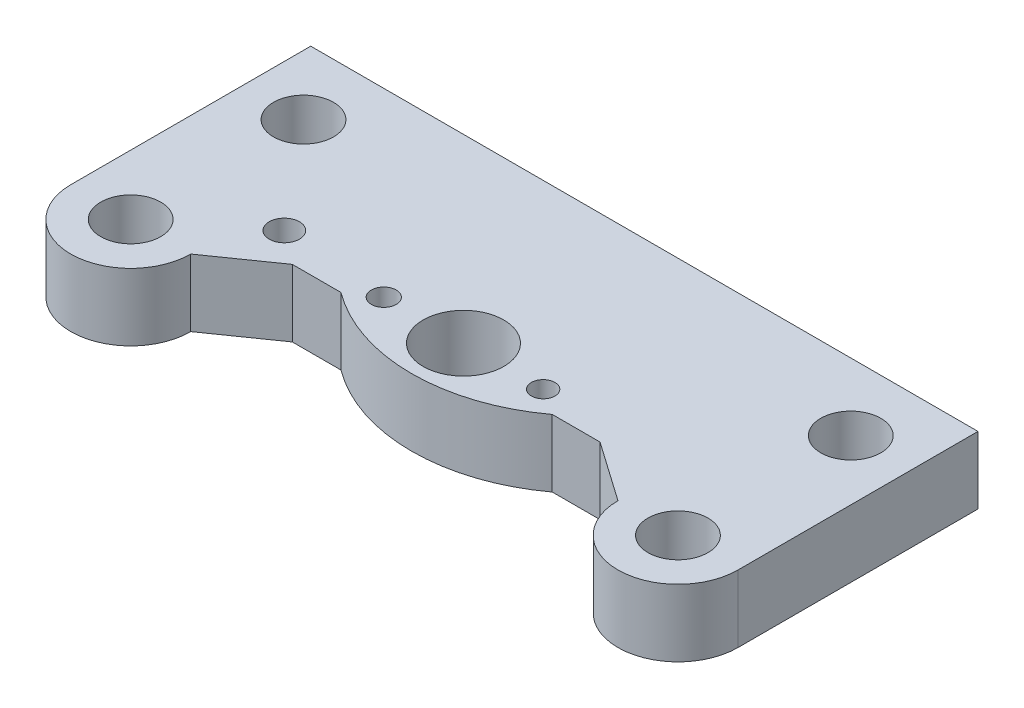
ISO-10303-21;
HEADER;
FILE_DESCRIPTION(('STEP AP214'),'2;1');
FILE_NAME('part.step','',(''),(''),'','','');
FILE_SCHEMA(('AUTOMOTIVE_DESIGN { 1 0 10303 214 1 1 1 1 }'));
ENDSEC;
DATA;
#1=APPLICATION_CONTEXT('core data for automotive mechanical design processes');
#2=APPLICATION_PROTOCOL_DEFINITION('international standard','automotive_design',2000,#1);
#3=PRODUCT_CONTEXT('',#1,'mechanical');
#4=PRODUCT('Part','Part','',(#3));
#5=PRODUCT_RELATED_PRODUCT_CATEGORY('part','',(#4));
#6=PRODUCT_DEFINITION_FORMATION('','',#4);
#7=PRODUCT_DEFINITION_CONTEXT('part definition',#1,'design');
#8=PRODUCT_DEFINITION('design','',#6,#7);
#9=PRODUCT_DEFINITION_SHAPE('','',#8);
#10=(LENGTH_UNIT() NAMED_UNIT(*) SI_UNIT(.MILLI.,.METRE.));
#11=(NAMED_UNIT(*) PLANE_ANGLE_UNIT() SI_UNIT($,.RADIAN.));
#12=(NAMED_UNIT(*) SI_UNIT($,.STERADIAN.) SOLID_ANGLE_UNIT());
#13=UNCERTAINTY_MEASURE_WITH_UNIT(LENGTH_MEASURE(1.E-05),#10,'distance_accuracy_value','');
#14=(GEOMETRIC_REPRESENTATION_CONTEXT(3) GLOBAL_UNCERTAINTY_ASSIGNED_CONTEXT((#13)) GLOBAL_UNIT_ASSIGNED_CONTEXT((#10,
#11,#12)) REPRESENTATION_CONTEXT('',''));
#15=CARTESIAN_POINT('',(0.,0.,0.));
#16=DIRECTION('',(0.,0.,1.));
#17=DIRECTION('',(1.,0.,0.));
#18=AXIS2_PLACEMENT_3D('',#15,#16,#17);
#19=CARTESIAN_POINT('',(72.39,-8.89,0.));
#20=DIRECTION('',(0.,1.,0.));
#21=DIRECTION('',(0.,0.,1.));
#22=AXIS2_PLACEMENT_3D('',#19,#20,#21);
#23=CYLINDRICAL_SURFACE('',#22,7.93749999999999);
#24=CARTESIAN_POINT('',(72.39,0.,0.));
#25=DIRECTION('',(0.,1.,0.));
#26=DIRECTION('',(0.,0.,-1.));
#27=AXIS2_PLACEMENT_3D('',#24,#25,#26);
#28=CIRCLE('',#27,7.93749999999999);
#29=CARTESIAN_POINT('',(64.4525,0.,0.));
#30=VERTEX_POINT('',#29);
#31=CARTESIAN_POINT('',(80.3275,0.,0.));
#32=VERTEX_POINT('',#31);
#33=EDGE_CURVE('E157',#30,#32,#28,.T.);
#34=ORIENTED_EDGE('',*,*,#33,.F.);
#35=DIRECTION('',(0.,1.,0.));
#36=VECTOR('',#35,1.);
#37=CARTESIAN_POINT('',(64.4525,-8.89,0.));
#38=LINE('',#37,#36);
#39=CARTESIAN_POINT('',(64.4525,-8.89,0.));
#40=VERTEX_POINT('',#39);
#41=EDGE_CURVE('E11',#40,#30,#38,.T.);
#42=ORIENTED_EDGE('',*,*,#41,.F.);
#43=CARTESIAN_POINT('',(72.39,-8.89,0.));
#44=DIRECTION('',(0.,1.,0.));
#45=DIRECTION('',(0.,0.,-1.));
#46=AXIS2_PLACEMENT_3D('',#43,#44,#45);
#47=CIRCLE('',#46,7.93749999999999);
#48=CARTESIAN_POINT('',(80.3275,-8.89,0.));
#49=VERTEX_POINT('',#48);
#50=EDGE_CURVE('E194',#40,#49,#47,.T.);
#51=ORIENTED_EDGE('',*,*,#50,.T.);
#52=DIRECTION('',(0.,1.,0.));
#53=VECTOR('',#52,1.);
#54=CARTESIAN_POINT('',(80.3275,-8.89,0.));
#55=LINE('',#54,#53);
#56=EDGE_CURVE('E46',#49,#32,#55,.T.);
#57=ORIENTED_EDGE('',*,*,#56,.T.);
#58=EDGE_LOOP('',(#34,#42,#51,#57));
#59=FACE_BOUND('',#58,.T.);
#60=ADVANCED_FACE('F43',(#59),#23,.T.);
#61=CARTESIAN_POINT('',(64.4525,-8.89,0.));
#62=DIRECTION('',(-0.573576436351041,0.,0.819152044288995));
#63=DIRECTION('',(0.819152044288995,0.,0.573576436351041));
#64=AXIS2_PLACEMENT_3D('',#61,#62,#63);
#65=PLANE('',#64);
#66=DIRECTION('',(0.819152044288995,0.,0.573576436351041));
#67=VECTOR('',#66,1.);
#68=CARTESIAN_POINT('',(64.4525,0.,0.));
#69=LINE('',#68,#67);
#70=CARTESIAN_POINT('',(56.5460444685226,0.,-5.53615976366025));
#71=VERTEX_POINT('',#70);
#72=EDGE_CURVE('E191',#71,#30,#69,.T.);
#73=ORIENTED_EDGE('',*,*,#72,.F.);
#74=DIRECTION('',(0.,1.,0.));
#75=VECTOR('',#74,1.);
#76=CARTESIAN_POINT('',(56.5460444685226,-8.89,-5.53615976366025));
#77=LINE('',#76,#75);
#78=CARTESIAN_POINT('',(56.5460444685226,-8.89,-5.53615976366025));
#79=VERTEX_POINT('',#78);
#80=EDGE_CURVE('E53',#79,#71,#77,.T.);
#81=ORIENTED_EDGE('',*,*,#80,.F.);
#82=DIRECTION('',(0.819152044288995,0.,0.573576436351041));
#83=VECTOR('',#82,1.);
#84=CARTESIAN_POINT('',(64.4525,-8.89,0.));
#85=LINE('',#84,#83);
#86=EDGE_CURVE('E143',#79,#40,#85,.T.);
#87=ORIENTED_EDGE('',*,*,#86,.T.);
#88=ORIENTED_EDGE('',*,*,#41,.T.);
#89=EDGE_LOOP('',(#73,#81,#87,#88));
#90=FACE_BOUND('',#89,.T.);
#91=ADVANCED_FACE('F219',(#90),#65,.T.);
#92=CARTESIAN_POINT('',(56.5460444685226,-8.89,-5.53615976366025));
#93=DIRECTION('',(0.,0.,1.));
#94=DIRECTION('',(1.,0.,0.));
#95=AXIS2_PLACEMENT_3D('',#92,#93,#94);
#96=PLANE('',#95);
#97=DIRECTION('',(1.,0.,0.));
#98=VECTOR('',#97,1.);
#99=CARTESIAN_POINT('',(56.5460444685226,0.,-5.53615976366025));
#100=LINE('',#99,#98);
#101=CARTESIAN_POINT('',(50.2217496785397,0.,-5.53615976366026));
#102=VERTEX_POINT('',#101);
#103=EDGE_CURVE('E129',#102,#71,#100,.T.);
#104=ORIENTED_EDGE('',*,*,#103,.F.);
#105=DIRECTION('',(0.,1.,0.));
#106=VECTOR('',#105,1.);
#107=CARTESIAN_POINT('',(50.2217496785397,-8.89,-5.53615976366026));
#108=LINE('',#107,#106);
#109=CARTESIAN_POINT('',(50.2217496785397,-8.89,-5.53615976366026));
#110=VERTEX_POINT('',#109);
#111=EDGE_CURVE('E124',#110,#102,#108,.T.);
#112=ORIENTED_EDGE('',*,*,#111,.F.);
#113=DIRECTION('',(1.,0.,0.));
#114=VECTOR('',#113,1.);
#115=CARTESIAN_POINT('',(56.5460444685226,-8.89,-5.53615976366025));
#116=LINE('',#115,#114);
#117=EDGE_CURVE('E127',#110,#79,#116,.T.);
#118=ORIENTED_EDGE('',*,*,#117,.T.);
#119=ORIENTED_EDGE('',*,*,#80,.T.);
#120=EDGE_LOOP('',(#104,#112,#118,#119));
#121=FACE_BOUND('',#120,.T.);
#122=ADVANCED_FACE('F126',(#121),#96,.T.);
#123=CARTESIAN_POINT('',(36.248751472276,-8.89,-24.313610304422));
#124=DIRECTION('',(0.,1.,0.));
#125=DIRECTION('',(0.,0.,1.));
#126=AXIS2_PLACEMENT_3D('',#123,#124,#125);
#127=CYLINDRICAL_SURFACE('',#126,23.4059250550582);
#128=CARTESIAN_POINT('',(36.248751472276,0.,-24.313610304422));
#129=DIRECTION('',(0.,1.,0.));
#130=DIRECTION('',(0.,0.,1.));
#131=AXIS2_PLACEMENT_3D('',#128,#129,#130);
#132=CIRCLE('',#131,23.4059250550582);
#133=CARTESIAN_POINT('',(22.2757532660122,0.,-5.5361597636603));
#134=VERTEX_POINT('',#133);
#135=EDGE_CURVE('E186',#134,#102,#132,.T.);
#136=ORIENTED_EDGE('',*,*,#135,.F.);
#137=DIRECTION('',(0.,1.,0.));
#138=VECTOR('',#137,1.);
#139=CARTESIAN_POINT('',(22.2757532660122,-8.89,-5.5361597636603));
#140=LINE('',#139,#138);
#141=CARTESIAN_POINT('',(22.2757532660122,-8.89,-5.5361597636603));
#142=VERTEX_POINT('',#141);
#143=EDGE_CURVE('E135',#142,#134,#140,.T.);
#144=ORIENTED_EDGE('',*,*,#143,.F.);
#145=CARTESIAN_POINT('',(36.248751472276,-8.89,-24.313610304422));
#146=DIRECTION('',(0.,1.,0.));
#147=DIRECTION('',(0.,0.,1.));
#148=AXIS2_PLACEMENT_3D('',#145,#146,#147);
#149=CIRCLE('',#148,23.4059250550582);
#150=EDGE_CURVE('E141',#142,#110,#149,.T.);
#151=ORIENTED_EDGE('',*,*,#150,.T.);
#152=ORIENTED_EDGE('',*,*,#111,.T.);
#153=EDGE_LOOP('',(#136,#144,#151,#152));
#154=FACE_BOUND('',#153,.T.);
#155=ADVANCED_FACE('F146',(#154),#127,.T.);
#156=CARTESIAN_POINT('',(15.8439555314773,-8.89,-5.5361597636603));
#157=DIRECTION('',(0.,0.,1.));
#158=DIRECTION('',(1.,0.,0.));
#159=AXIS2_PLACEMENT_3D('',#156,#157,#158);
#160=PLANE('',#159);
#161=DIRECTION('',(1.,0.,0.));
#162=VECTOR('',#161,1.);
#163=CARTESIAN_POINT('',(15.8439555314773,0.,-5.5361597636603));
#164=LINE('',#163,#162);
#165=CARTESIAN_POINT('',(15.8439555314773,0.,-5.5361597636603));
#166=VERTEX_POINT('',#165);
#167=EDGE_CURVE('E182',#166,#134,#164,.T.);
#168=ORIENTED_EDGE('',*,*,#167,.F.);
#169=DIRECTION('',(0.,1.,0.));
#170=VECTOR('',#169,1.);
#171=CARTESIAN_POINT('',(15.8439555314773,-8.89,-5.5361597636603));
#172=LINE('',#171,#170);
#173=CARTESIAN_POINT('',(15.8439555314773,-8.89,-5.5361597636603));
#174=VERTEX_POINT('',#173);
#175=EDGE_CURVE('E200',#174,#166,#172,.T.);
#176=ORIENTED_EDGE('',*,*,#175,.F.);
#177=DIRECTION('',(1.,0.,0.));
#178=VECTOR('',#177,1.);
#179=CARTESIAN_POINT('',(15.8439555314773,-8.89,-5.5361597636603));
#180=LINE('',#179,#178);
#181=EDGE_CURVE('E148',#174,#142,#180,.T.);
#182=ORIENTED_EDGE('',*,*,#181,.T.);
#183=ORIENTED_EDGE('',*,*,#143,.T.);
#184=EDGE_LOOP('',(#168,#176,#182,#183));
#185=FACE_BOUND('',#184,.T.);
#186=ADVANCED_FACE('F232',(#185),#160,.T.);
#187=CARTESIAN_POINT('',(7.9375,-8.89,0.));
#188=DIRECTION('',(0.573576436351047,0.,0.819152044288991));
#189=DIRECTION('',(0.819152044288992,0.,-0.573576436351047));
#190=AXIS2_PLACEMENT_3D('',#187,#188,#189);
#191=PLANE('',#190);
#192=DIRECTION('',(0.819152044288991,0.,-0.573576436351047));
#193=VECTOR('',#192,1.);
#194=CARTESIAN_POINT('',(7.9375,0.,0.));
#195=LINE('',#194,#193);
#196=CARTESIAN_POINT('',(7.9375,0.,0.));
#197=VERTEX_POINT('',#196);
#198=EDGE_CURVE('E178',#197,#166,#195,.T.);
#199=ORIENTED_EDGE('',*,*,#198,.F.);
#200=DIRECTION('',(0.,1.,0.));
#201=VECTOR('',#200,1.);
#202=CARTESIAN_POINT('',(7.9375,-8.89,0.));
#203=LINE('',#202,#201);
#204=CARTESIAN_POINT('',(7.9375,-8.89,0.));
#205=VERTEX_POINT('',#204);
#206=EDGE_CURVE('E203',#205,#197,#203,.T.);
#207=ORIENTED_EDGE('',*,*,#206,.F.);
#208=DIRECTION('',(0.819152044288991,0.,-0.573576436351047));
#209=VECTOR('',#208,1.);
#210=CARTESIAN_POINT('',(7.9375,-8.89,0.));
#211=LINE('',#210,#209);
#212=EDGE_CURVE('E151',#205,#174,#211,.T.);
#213=ORIENTED_EDGE('',*,*,#212,.T.);
#214=ORIENTED_EDGE('',*,*,#175,.T.);
#215=EDGE_LOOP('',(#199,#207,#213,#214));
#216=FACE_BOUND('',#215,.T.);
#217=ADVANCED_FACE('F235',(#216),#191,.T.);
#218=CARTESIAN_POINT('',(0.,-8.89,0.));
#219=DIRECTION('',(0.,1.,0.));
#220=DIRECTION('',(0.,0.,1.));
#221=AXIS2_PLACEMENT_3D('',#218,#219,#220);
#222=CYLINDRICAL_SURFACE('',#221,7.9375);
#223=CARTESIAN_POINT('',(0.,0.,0.));
#224=DIRECTION('',(0.,1.,0.));
#225=DIRECTION('',(0.,0.,-1.));
#226=AXIS2_PLACEMENT_3D('',#223,#224,#225);
#227=CIRCLE('',#226,7.9375);
#228=CARTESIAN_POINT('',(-7.9375,0.,0.));
#229=VERTEX_POINT('',#228);
#230=EDGE_CURVE('E174',#229,#197,#227,.T.);
#231=ORIENTED_EDGE('',*,*,#230,.F.);
#232=DIRECTION('',(0.,1.,0.));
#233=VECTOR('',#232,1.);
#234=CARTESIAN_POINT('',(-7.9375,-8.89,0.));
#235=LINE('',#234,#233);
#236=CARTESIAN_POINT('',(-7.9375,-8.89,0.));
#237=VERTEX_POINT('',#236);
#238=EDGE_CURVE('E206',#237,#229,#235,.T.);
#239=ORIENTED_EDGE('',*,*,#238,.F.);
#240=CARTESIAN_POINT('',(0.,-8.89,0.));
#241=DIRECTION('',(0.,1.,0.));
#242=DIRECTION('',(0.,0.,-1.));
#243=AXIS2_PLACEMENT_3D('',#240,#241,#242);
#244=CIRCLE('',#243,7.9375);
#245=EDGE_CURVE('E375',#237,#205,#244,.T.);
#246=ORIENTED_EDGE('',*,*,#245,.T.);
#247=ORIENTED_EDGE('',*,*,#206,.T.);
#248=EDGE_LOOP('',(#231,#239,#246,#247));
#249=FACE_BOUND('',#248,.T.);
#250=ADVANCED_FACE('F239',(#249),#222,.T.);
#251=CARTESIAN_POINT('',(-7.9375,-8.89,0.));
#252=DIRECTION('',(-1.,0.,0.));
#253=DIRECTION('',(0.,0.,1.));
#254=AXIS2_PLACEMENT_3D('',#251,#252,#253);
#255=PLANE('',#254);
#256=DIRECTION('',(0.,0.,1.));
#257=VECTOR('',#256,1.);
#258=CARTESIAN_POINT('',(-7.9375,0.,0.));
#259=LINE('',#258,#257);
#260=CARTESIAN_POINT('',(-7.9375,0.,-31.75));
#261=VERTEX_POINT('',#260);
#262=EDGE_CURVE('E170',#261,#229,#259,.T.);
#263=ORIENTED_EDGE('',*,*,#262,.F.);
#264=DIRECTION('',(0.,1.,0.));
#265=VECTOR('',#264,1.);
#266=CARTESIAN_POINT('',(-7.9375,-8.89,-31.75));
#267=LINE('',#266,#265);
#268=CARTESIAN_POINT('',(-7.9375,-8.89,-31.75));
#269=VERTEX_POINT('',#268);
#270=EDGE_CURVE('E209',#269,#261,#267,.T.);
#271=ORIENTED_EDGE('',*,*,#270,.F.);
#272=DIRECTION('',(0.,0.,1.));
#273=VECTOR('',#272,1.);
#274=CARTESIAN_POINT('',(-7.9375,-8.89,-31.75));
#275=LINE('',#274,#273);
#276=EDGE_CURVE('E372',#269,#237,#275,.T.);
#277=ORIENTED_EDGE('',*,*,#276,.T.);
#278=ORIENTED_EDGE('',*,*,#238,.T.);
#279=EDGE_LOOP('',(#263,#271,#277,#278));
#280=FACE_BOUND('',#279,.T.);
#281=ADVANCED_FACE('F243',(#280),#255,.T.);
#282=CARTESIAN_POINT('',(80.3275,-8.89,-31.75));
#283=DIRECTION('',(0.,0.,-1.));
#284=DIRECTION('',(-1.,0.,0.));
#285=AXIS2_PLACEMENT_3D('',#282,#283,#284);
#286=PLANE('',#285);
#287=DIRECTION('',(-1.,0.,0.));
#288=VECTOR('',#287,1.);
#289=CARTESIAN_POINT('',(80.3275,0.,-31.75));
#290=LINE('',#289,#288);
#291=CARTESIAN_POINT('',(80.3275,0.,-31.75));
#292=VERTEX_POINT('',#291);
#293=EDGE_CURVE('E166',#292,#261,#290,.T.);
#294=ORIENTED_EDGE('',*,*,#293,.F.);
#295=DIRECTION('',(0.,1.,0.));
#296=VECTOR('',#295,1.);
#297=CARTESIAN_POINT('',(80.3275,-8.89,-31.75));
#298=LINE('',#297,#296);
#299=CARTESIAN_POINT('',(80.3275,-8.89,-31.75));
#300=VERTEX_POINT('',#299);
#301=EDGE_CURVE('E212',#300,#292,#298,.T.);
#302=ORIENTED_EDGE('',*,*,#301,.F.);
#303=DIRECTION('',(-1.,0.,0.));
#304=VECTOR('',#303,1.);
#305=CARTESIAN_POINT('',(80.3275,-8.89,-31.75));
#306=LINE('',#305,#304);
#307=EDGE_CURVE('E368',#300,#269,#306,.T.);
#308=ORIENTED_EDGE('',*,*,#307,.T.);
#309=ORIENTED_EDGE('',*,*,#270,.T.);
#310=EDGE_LOOP('',(#294,#302,#308,#309));
#311=FACE_BOUND('',#310,.T.);
#312=ADVANCED_FACE('F247',(#311),#286,.T.);
#313=CARTESIAN_POINT('',(80.3275,-8.89,-31.75));
#314=DIRECTION('',(1.,0.,0.));
#315=DIRECTION('',(0.,0.,-1.));
#316=AXIS2_PLACEMENT_3D('',#313,#314,#315);
#317=PLANE('',#316);
#318=DIRECTION('',(0.,0.,-1.));
#319=VECTOR('',#318,1.);
#320=CARTESIAN_POINT('',(80.3275,0.,-31.75));
#321=LINE('',#320,#319);
#322=EDGE_CURVE('E161',#32,#292,#321,.T.);
#323=ORIENTED_EDGE('',*,*,#322,.F.);
#324=ORIENTED_EDGE('',*,*,#56,.F.);
#325=DIRECTION('',(0.,0.,-1.));
#326=VECTOR('',#325,1.);
#327=CARTESIAN_POINT('',(80.3275,-8.89,-13.97));
#328=LINE('',#327,#326);
#329=EDGE_CURVE('E365',#49,#300,#328,.T.);
#330=ORIENTED_EDGE('',*,*,#329,.T.);
#331=ORIENTED_EDGE('',*,*,#301,.T.);
#332=EDGE_LOOP('',(#323,#324,#330,#331));
#333=FACE_BOUND('',#332,.T.);
#334=ADVANCED_FACE('F250',(#333),#317,.T.);
#335=CARTESIAN_POINT('',(72.39,-8.89,0.));
#336=DIRECTION('',(0.,-1.,0.));
#337=DIRECTION('',(0.,0.,-1.));
#338=AXIS2_PLACEMENT_3D('',#335,#336,#337);
#339=PLANE('',#338);
#340=CARTESIAN_POINT('',(46.736,-8.89,-7.82215976366029));
#341=DIRECTION('',(0.,1.,0.));
#342=DIRECTION('',(0.,0.,1.));
#343=AXIS2_PLACEMENT_3D('',#340,#341,#342);
#344=CIRCLE('',#343,1.55958710743831);
#345=CARTESIAN_POINT('',(46.736,-8.89,-6.26257265622199));
#346=VERTEX_POINT('',#345);
#347=EDGE_CURVE('E299',#346,#346,#344,.T.);
#348=ORIENTED_EDGE('',*,*,#347,.T.);
#349=EDGE_LOOP('',(#348));
#350=FACE_BOUND('',#349,.T.);
#351=CARTESIAN_POINT('',(36.1949999999999,-8.89,-7.82215976366029));
#352=DIRECTION('',(0.,1.,0.));
#353=DIRECTION('',(0.,0.,1.));
#354=AXIS2_PLACEMENT_3D('',#351,#352,#353);
#355=CIRCLE('',#354,5.334);
#356=CARTESIAN_POINT('',(36.1949999999999,-8.89,-2.4881597636603));
#357=VERTEX_POINT('',#356);
#358=EDGE_CURVE('E309',#357,#357,#355,.T.);
#359=ORIENTED_EDGE('',*,*,#358,.T.);
#360=EDGE_LOOP('',(#359));
#361=FACE_BOUND('',#360,.T.);
#362=CARTESIAN_POINT('',(25.654,-8.89,-7.82215976366029));
#363=DIRECTION('',(0.,1.,0.));
#364=DIRECTION('',(0.,0.,1.));
#365=AXIS2_PLACEMENT_3D('',#362,#363,#364);
#366=CIRCLE('',#365,1.651);
#367=CARTESIAN_POINT('',(25.654,-8.89,-6.17115976366029));
#368=VERTEX_POINT('',#367);
#369=EDGE_CURVE('E317',#368,#368,#366,.T.);
#370=ORIENTED_EDGE('',*,*,#369,.T.);
#371=EDGE_LOOP('',(#370));
#372=FACE_BOUND('',#371,.T.);
#373=CARTESIAN_POINT('',(11.43,-8.89,-8.89));
#374=DIRECTION('',(0.,1.,0.));
#375=DIRECTION('',(0.,0.,1.));
#376=AXIS2_PLACEMENT_3D('',#373,#374,#375);
#377=CIRCLE('',#376,2.);
#378=CARTESIAN_POINT('',(11.43,-8.89,-6.89));
#379=VERTEX_POINT('',#378);
#380=EDGE_CURVE('E325',#379,#379,#377,.T.);
#381=ORIENTED_EDGE('',*,*,#380,.T.);
#382=EDGE_LOOP('',(#381));
#383=FACE_BOUND('',#382,.T.);
#384=CARTESIAN_POINT('',(0.,-8.89,-22.86));
#385=DIRECTION('',(0.,1.,0.));
#386=DIRECTION('',(0.,0.,1.));
#387=AXIS2_PLACEMENT_3D('',#384,#385,#386);
#388=CIRCLE('',#387,3.96875);
#389=CARTESIAN_POINT('',(0.,-8.89,-18.89125));
#390=VERTEX_POINT('',#389);
#391=EDGE_CURVE('E333',#390,#390,#388,.T.);
#392=ORIENTED_EDGE('',*,*,#391,.T.);
#393=EDGE_LOOP('',(#392));
#394=FACE_BOUND('',#393,.T.);
#395=CARTESIAN_POINT('',(72.39,-8.89,-22.86));
#396=DIRECTION('',(0.,1.,0.));
#397=DIRECTION('',(0.,0.,1.));
#398=AXIS2_PLACEMENT_3D('',#395,#396,#397);
#399=CIRCLE('',#398,3.96875000000001);
#400=CARTESIAN_POINT('',(72.39,-8.89,-18.89125));
#401=VERTEX_POINT('',#400);
#402=EDGE_CURVE('E341',#401,#401,#399,.T.);
#403=ORIENTED_EDGE('',*,*,#402,.T.);
#404=EDGE_LOOP('',(#403));
#405=FACE_BOUND('',#404,.T.);
#406=CARTESIAN_POINT('',(72.39,-8.89,0.));
#407=DIRECTION('',(0.,1.,0.));
#408=DIRECTION('',(0.,0.,1.));
#409=AXIS2_PLACEMENT_3D('',#406,#407,#408);
#410=CIRCLE('',#409,3.96875);
#411=CARTESIAN_POINT('',(72.39,-8.89,3.96875));
#412=VERTEX_POINT('',#411);
#413=EDGE_CURVE('E349',#412,#412,#410,.T.);
#414=ORIENTED_EDGE('',*,*,#413,.T.);
#415=EDGE_LOOP('',(#414));
#416=FACE_BOUND('',#415,.T.);
#417=CARTESIAN_POINT('',(0.,-8.89,0.));
#418=DIRECTION('',(0.,1.,0.));
#419=DIRECTION('',(0.,0.,1.));
#420=AXIS2_PLACEMENT_3D('',#417,#418,#419);
#421=CIRCLE('',#420,3.96875);
#422=CARTESIAN_POINT('',(0.,-8.89,3.96875));
#423=VERTEX_POINT('',#422);
#424=EDGE_CURVE('E162',#423,#423,#421,.T.);
#425=ORIENTED_EDGE('',*,*,#424,.T.);
#426=EDGE_LOOP('',(#425));
#427=FACE_BOUND('',#426,.T.);
#428=ORIENTED_EDGE('',*,*,#50,.F.);
#429=ORIENTED_EDGE('',*,*,#86,.F.);
#430=ORIENTED_EDGE('',*,*,#117,.F.);
#431=ORIENTED_EDGE('',*,*,#150,.F.);
#432=ORIENTED_EDGE('',*,*,#181,.F.);
#433=ORIENTED_EDGE('',*,*,#212,.F.);
#434=ORIENTED_EDGE('',*,*,#245,.F.);
#435=ORIENTED_EDGE('',*,*,#276,.F.);
#436=ORIENTED_EDGE('',*,*,#307,.F.);
#437=ORIENTED_EDGE('',*,*,#329,.F.);
#438=EDGE_LOOP('',(#428,#429,#430,#431,#432,#433,#434,#435,#436,#437));
#439=FACE_BOUND('',#438,.T.);
#440=ADVANCED_FACE('F139',(#350,#361,#372,#383,#394,#405,#416,#427,#439),#339,.T.);
#441=CARTESIAN_POINT('',(72.39,0.,0.));
#442=DIRECTION('',(0.,-1.,0.));
#443=DIRECTION('',(0.,0.,-1.));
#444=AXIS2_PLACEMENT_3D('',#441,#442,#443);
#445=PLANE('',#444);
#446=CARTESIAN_POINT('',(46.736,0.,-7.82215976366029));
#447=DIRECTION('',(0.,1.,0.));
#448=DIRECTION('',(0.,0.,1.));
#449=AXIS2_PLACEMENT_3D('',#446,#447,#448);
#450=CIRCLE('',#449,1.55958710743831);
#451=CARTESIAN_POINT('',(46.736,0.,-6.26257265622199));
#452=VERTEX_POINT('',#451);
#453=EDGE_CURVE('E302',#452,#452,#450,.T.);
#454=ORIENTED_EDGE('',*,*,#453,.F.);
#455=EDGE_LOOP('',(#454));
#456=FACE_BOUND('',#455,.T.);
#457=CARTESIAN_POINT('',(36.1949999999999,0.,-7.82215976366029));
#458=DIRECTION('',(0.,1.,0.));
#459=DIRECTION('',(0.,0.,1.));
#460=AXIS2_PLACEMENT_3D('',#457,#458,#459);
#461=CIRCLE('',#460,5.334);
#462=CARTESIAN_POINT('',(36.1949999999999,0.,-2.4881597636603));
#463=VERTEX_POINT('',#462);
#464=EDGE_CURVE('E306',#463,#463,#461,.T.);
#465=ORIENTED_EDGE('',*,*,#464,.F.);
#466=EDGE_LOOP('',(#465));
#467=FACE_BOUND('',#466,.T.);
#468=CARTESIAN_POINT('',(25.654,0.,-7.82215976366029));
#469=DIRECTION('',(0.,1.,0.));
#470=DIRECTION('',(0.,0.,1.));
#471=AXIS2_PLACEMENT_3D('',#468,#469,#470);
#472=CIRCLE('',#471,1.651);
#473=CARTESIAN_POINT('',(25.654,0.,-6.17115976366029));
#474=VERTEX_POINT('',#473);
#475=EDGE_CURVE('E313',#474,#474,#472,.T.);
#476=ORIENTED_EDGE('',*,*,#475,.F.);
#477=EDGE_LOOP('',(#476));
#478=FACE_BOUND('',#477,.T.);
#479=CARTESIAN_POINT('',(11.43,0.,-8.89));
#480=DIRECTION('',(0.,1.,0.));
#481=DIRECTION('',(0.,0.,1.));
#482=AXIS2_PLACEMENT_3D('',#479,#480,#481);
#483=CIRCLE('',#482,2.);
#484=CARTESIAN_POINT('',(11.43,0.,-6.89));
#485=VERTEX_POINT('',#484);
#486=EDGE_CURVE('E321',#485,#485,#483,.T.);
#487=ORIENTED_EDGE('',*,*,#486,.F.);
#488=EDGE_LOOP('',(#487));
#489=FACE_BOUND('',#488,.T.);
#490=CARTESIAN_POINT('',(0.,0.,-22.86));
#491=DIRECTION('',(0.,1.,0.));
#492=DIRECTION('',(0.,0.,1.));
#493=AXIS2_PLACEMENT_3D('',#490,#491,#492);
#494=CIRCLE('',#493,3.96875);
#495=CARTESIAN_POINT('',(0.,0.,-18.89125));
#496=VERTEX_POINT('',#495);
#497=EDGE_CURVE('E329',#496,#496,#494,.T.);
#498=ORIENTED_EDGE('',*,*,#497,.F.);
#499=EDGE_LOOP('',(#498));
#500=FACE_BOUND('',#499,.T.);
#501=CARTESIAN_POINT('',(72.39,0.,-22.86));
#502=DIRECTION('',(0.,1.,0.));
#503=DIRECTION('',(0.,0.,1.));
#504=AXIS2_PLACEMENT_3D('',#501,#502,#503);
#505=CIRCLE('',#504,3.96875000000001);
#506=CARTESIAN_POINT('',(72.39,0.,-18.89125));
#507=VERTEX_POINT('',#506);
#508=EDGE_CURVE('E337',#507,#507,#505,.T.);
#509=ORIENTED_EDGE('',*,*,#508,.F.);
#510=EDGE_LOOP('',(#509));
#511=FACE_BOUND('',#510,.T.);
#512=CARTESIAN_POINT('',(72.39,0.,0.));
#513=DIRECTION('',(0.,1.,0.));
#514=DIRECTION('',(0.,0.,1.));
#515=AXIS2_PLACEMENT_3D('',#512,#513,#514);
#516=CIRCLE('',#515,3.96875);
#517=CARTESIAN_POINT('',(72.39,0.,3.96875));
#518=VERTEX_POINT('',#517);
#519=EDGE_CURVE('E345',#518,#518,#516,.T.);
#520=ORIENTED_EDGE('',*,*,#519,.F.);
#521=EDGE_LOOP('',(#520));
#522=FACE_BOUND('',#521,.T.);
#523=CARTESIAN_POINT('',(0.,0.,0.));
#524=DIRECTION('',(0.,1.,0.));
#525=DIRECTION('',(0.,0.,1.));
#526=AXIS2_PLACEMENT_3D('',#523,#524,#525);
#527=CIRCLE('',#526,3.96875);
#528=CARTESIAN_POINT('',(0.,0.,3.96875));
#529=VERTEX_POINT('',#528);
#530=EDGE_CURVE('E353',#529,#529,#527,.T.);
#531=ORIENTED_EDGE('',*,*,#530,.F.);
#532=EDGE_LOOP('',(#531));
#533=FACE_BOUND('',#532,.T.);
#534=ORIENTED_EDGE('',*,*,#33,.T.);
#535=ORIENTED_EDGE('',*,*,#322,.T.);
#536=ORIENTED_EDGE('',*,*,#293,.T.);
#537=ORIENTED_EDGE('',*,*,#262,.T.);
#538=ORIENTED_EDGE('',*,*,#230,.T.);
#539=ORIENTED_EDGE('',*,*,#198,.T.);
#540=ORIENTED_EDGE('',*,*,#167,.T.);
#541=ORIENTED_EDGE('',*,*,#135,.T.);
#542=ORIENTED_EDGE('',*,*,#103,.T.);
#543=ORIENTED_EDGE('',*,*,#72,.T.);
#544=EDGE_LOOP('',(#534,#535,#536,#537,#538,#539,#540,#541,#542,#543));
#545=FACE_BOUND('',#544,.T.);
#546=ADVANCED_FACE('F218',(#456,#467,#478,#489,#500,#511,#522,#533,#545),#445,.F.);
#547=CARTESIAN_POINT('',(0.,-8.89,0.));
#548=DIRECTION('',(0.,1.,0.));
#549=DIRECTION('',(0.,0.,1.));
#550=AXIS2_PLACEMENT_3D('',#547,#548,#549);
#551=CYLINDRICAL_SURFACE('',#550,3.96875);
#552=ORIENTED_EDGE('',*,*,#424,.F.);
#553=EDGE_LOOP('',(#552));
#554=FACE_BOUND('',#553,.T.);
#555=ORIENTED_EDGE('',*,*,#530,.T.);
#556=EDGE_LOOP('',(#555));
#557=FACE_BOUND('',#556,.T.);
#558=ADVANCED_FACE('F260',(#554,#557),#551,.F.);
#559=CARTESIAN_POINT('',(72.39,-8.89,0.));
#560=DIRECTION('',(0.,1.,0.));
#561=DIRECTION('',(0.,0.,1.));
#562=AXIS2_PLACEMENT_3D('',#559,#560,#561);
#563=CYLINDRICAL_SURFACE('',#562,3.96875);
#564=ORIENTED_EDGE('',*,*,#413,.F.);
#565=EDGE_LOOP('',(#564));
#566=FACE_BOUND('',#565,.T.);
#567=ORIENTED_EDGE('',*,*,#519,.T.);
#568=EDGE_LOOP('',(#567));
#569=FACE_BOUND('',#568,.T.);
#570=ADVANCED_FACE('F267',(#566,#569),#563,.F.);
#571=CARTESIAN_POINT('',(72.39,-8.89,-22.86));
#572=DIRECTION('',(0.,1.,0.));
#573=DIRECTION('',(0.,0.,1.));
#574=AXIS2_PLACEMENT_3D('',#571,#572,#573);
#575=CYLINDRICAL_SURFACE('',#574,3.96875000000001);
#576=ORIENTED_EDGE('',*,*,#402,.F.);
#577=EDGE_LOOP('',(#576));
#578=FACE_BOUND('',#577,.T.);
#579=ORIENTED_EDGE('',*,*,#508,.T.);
#580=EDGE_LOOP('',(#579));
#581=FACE_BOUND('',#580,.T.);
#582=ADVANCED_FACE('F271',(#578,#581),#575,.F.);
#583=CARTESIAN_POINT('',(0.,-8.89,-22.86));
#584=DIRECTION('',(0.,1.,0.));
#585=DIRECTION('',(0.,0.,1.));
#586=AXIS2_PLACEMENT_3D('',#583,#584,#585);
#587=CYLINDRICAL_SURFACE('',#586,3.96875);
#588=ORIENTED_EDGE('',*,*,#391,.F.);
#589=EDGE_LOOP('',(#588));
#590=FACE_BOUND('',#589,.T.);
#591=ORIENTED_EDGE('',*,*,#497,.T.);
#592=EDGE_LOOP('',(#591));
#593=FACE_BOUND('',#592,.T.);
#594=ADVANCED_FACE('F275',(#590,#593),#587,.F.);
#595=CARTESIAN_POINT('',(11.43,-8.89,-8.89));
#596=DIRECTION('',(0.,1.,0.));
#597=DIRECTION('',(0.,0.,1.));
#598=AXIS2_PLACEMENT_3D('',#595,#596,#597);
#599=CYLINDRICAL_SURFACE('',#598,2.);
#600=ORIENTED_EDGE('',*,*,#380,.F.);
#601=EDGE_LOOP('',(#600));
#602=FACE_BOUND('',#601,.T.);
#603=ORIENTED_EDGE('',*,*,#486,.T.);
#604=EDGE_LOOP('',(#603));
#605=FACE_BOUND('',#604,.T.);
#606=ADVANCED_FACE('F279',(#602,#605),#599,.F.);
#607=CARTESIAN_POINT('',(25.654,-8.89,-7.82215976366029));
#608=DIRECTION('',(0.,1.,0.));
#609=DIRECTION('',(0.,0.,1.));
#610=AXIS2_PLACEMENT_3D('',#607,#608,#609);
#611=CYLINDRICAL_SURFACE('',#610,1.651);
#612=ORIENTED_EDGE('',*,*,#369,.F.);
#613=EDGE_LOOP('',(#612));
#614=FACE_BOUND('',#613,.T.);
#615=ORIENTED_EDGE('',*,*,#475,.T.);
#616=EDGE_LOOP('',(#615));
#617=FACE_BOUND('',#616,.T.);
#618=ADVANCED_FACE('F283',(#614,#617),#611,.F.);
#619=CARTESIAN_POINT('',(36.1949999999999,-8.89,-7.82215976366029));
#620=DIRECTION('',(0.,1.,0.));
#621=DIRECTION('',(0.,0.,1.));
#622=AXIS2_PLACEMENT_3D('',#619,#620,#621);
#623=CYLINDRICAL_SURFACE('',#622,5.334);
#624=ORIENTED_EDGE('',*,*,#358,.F.);
#625=EDGE_LOOP('',(#624));
#626=FACE_BOUND('',#625,.T.);
#627=ORIENTED_EDGE('',*,*,#464,.T.);
#628=EDGE_LOOP('',(#627));
#629=FACE_BOUND('',#628,.T.);
#630=ADVANCED_FACE('F287',(#626,#629),#623,.F.);
#631=CARTESIAN_POINT('',(46.736,-8.89,-7.82215976366029));
#632=DIRECTION('',(0.,1.,0.));
#633=DIRECTION('',(0.,0.,1.));
#634=AXIS2_PLACEMENT_3D('',#631,#632,#633);
#635=CYLINDRICAL_SURFACE('',#634,1.55958710743831);
#636=ORIENTED_EDGE('',*,*,#347,.F.);
#637=EDGE_LOOP('',(#636));
#638=FACE_BOUND('',#637,.T.);
#639=ORIENTED_EDGE('',*,*,#453,.T.);
#640=EDGE_LOOP('',(#639));
#641=FACE_BOUND('',#640,.T.);
#642=ADVANCED_FACE('F291',(#638,#641),#635,.F.);
#643=CLOSED_SHELL('',(#60,#91,#122,#155,#186,#217,#250,#281,#312,#334,#440,#546,#558,#570,#582,
#594,#606,#618,#630,#642));
#644=MANIFOLD_SOLID_BREP('B2',#643);
#645=ADVANCED_BREP_SHAPE_REPRESENTATION('',(#18,#644),#14);
#646=SHAPE_DEFINITION_REPRESENTATION(#9,#645);
ENDSEC;
END-ISO-10303-21;
